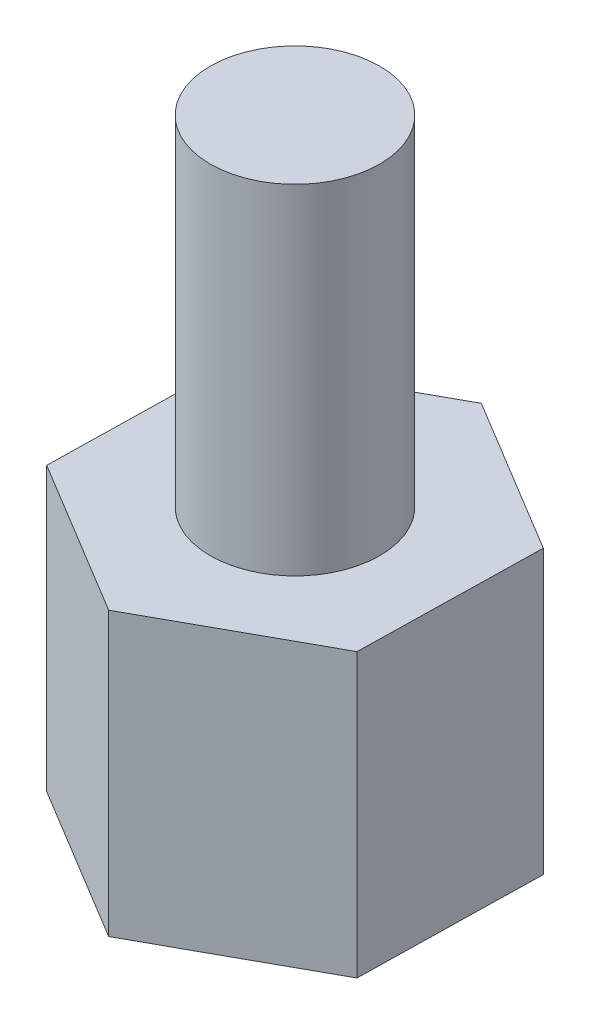
ISO-10303-21;
HEADER;
FILE_DESCRIPTION(('STEP AP214'),'2;1');
FILE_NAME('part.step','',(''),(''),'','','');
FILE_SCHEMA(('AUTOMOTIVE_DESIGN { 1 0 10303 214 1 1 1 1 }'));
ENDSEC;
DATA;
#1=APPLICATION_CONTEXT('core data for automotive mechanical design processes');
#2=APPLICATION_PROTOCOL_DEFINITION('international standard','automotive_design',2000,#1);
#3=PRODUCT_CONTEXT('',#1,'mechanical');
#4=PRODUCT('Part','Part','',(#3));
#5=PRODUCT_RELATED_PRODUCT_CATEGORY('part','',(#4));
#6=PRODUCT_DEFINITION_FORMATION('','',#4);
#7=PRODUCT_DEFINITION_CONTEXT('part definition',#1,'design');
#8=PRODUCT_DEFINITION('design','',#6,#7);
#9=PRODUCT_DEFINITION_SHAPE('','',#8);
#10=(LENGTH_UNIT() NAMED_UNIT(*) SI_UNIT(.MILLI.,.METRE.));
#11=(NAMED_UNIT(*) PLANE_ANGLE_UNIT() SI_UNIT($,.RADIAN.));
#12=(NAMED_UNIT(*) SI_UNIT($,.STERADIAN.) SOLID_ANGLE_UNIT());
#13=UNCERTAINTY_MEASURE_WITH_UNIT(LENGTH_MEASURE(1.E-05),#10,'distance_accuracy_value','');
#14=(GEOMETRIC_REPRESENTATION_CONTEXT(3) GLOBAL_UNCERTAINTY_ASSIGNED_CONTEXT((#13)) GLOBAL_UNIT_ASSIGNED_CONTEXT((#10,
#11,#12)) REPRESENTATION_CONTEXT('',''));
#15=CARTESIAN_POINT('',(0.,0.,0.));
#16=DIRECTION('',(0.,0.,1.));
#17=DIRECTION('',(1.,0.,0.));
#18=AXIS2_PLACEMENT_3D('',#15,#16,#17);
#19=CARTESIAN_POINT('',(0.,11.,0.));
#20=DIRECTION('',(0.,-1.,0.));
#21=DIRECTION('',(0.,0.,-1.));
#22=AXIS2_PLACEMENT_3D('',#19,#20,#21);
#23=CYLINDRICAL_SURFACE('',#22,1.5);
#24=CARTESIAN_POINT('',(0.,11.,0.));
#25=DIRECTION('',(0.,1.,0.));
#26=DIRECTION('',(0.,0.,1.));
#27=AXIS2_PLACEMENT_3D('',#24,#25,#26);
#28=CIRCLE('',#27,1.5);
#29=CARTESIAN_POINT('',(0.,11.,1.5));
#30=VERTEX_POINT('',#29);
#31=EDGE_CURVE('E11',#30,#30,#28,.T.);
#32=ORIENTED_EDGE('',*,*,#31,.F.);
#33=EDGE_LOOP('',(#32));
#34=FACE_BOUND('',#33,.T.);
#35=CARTESIAN_POINT('',(0.,5.,0.));
#36=DIRECTION('',(0.,1.,0.));
#37=DIRECTION('',(0.,0.,1.));
#38=AXIS2_PLACEMENT_3D('',#35,#36,#37);
#39=CIRCLE('',#38,1.5);
#40=CARTESIAN_POINT('',(0.,5.,1.5));
#41=VERTEX_POINT('',#40);
#42=EDGE_CURVE('E50',#41,#41,#39,.T.);
#43=ORIENTED_EDGE('',*,*,#42,.T.);
#44=EDGE_LOOP('',(#43));
#45=FACE_BOUND('',#44,.T.);
#46=ADVANCED_FACE('F47',(#34,#45),#23,.T.);
#47=CARTESIAN_POINT('',(0.,11.,0.));
#48=DIRECTION('',(0.,1.,0.));
#49=DIRECTION('',(0.,0.,1.));
#50=AXIS2_PLACEMENT_3D('',#47,#48,#49);
#51=PLANE('',#50);
#52=ORIENTED_EDGE('',*,*,#31,.T.);
#53=EDGE_LOOP('',(#52));
#54=FACE_BOUND('',#53,.T.);
#55=ADVANCED_FACE('F62',(#54),#51,.T.);
#56=CARTESIAN_POINT('',(0.,5.,0.));
#57=DIRECTION('',(0.,1.,0.));
#58=DIRECTION('',(0.,0.,1.));
#59=AXIS2_PLACEMENT_3D('',#56,#57,#58);
#60=PLANE('',#59);
#61=ORIENTED_EDGE('',*,*,#42,.F.);
#62=EDGE_LOOP('',(#61));
#63=FACE_BOUND('',#62,.T.);
#64=ADVANCED_FACE('F60',(#63),#60,.F.);
#65=CLOSED_SHELL('',(#46,#55,#64));
#66=MANIFOLD_SOLID_BREP('B2',#65);
#67=CARTESIAN_POINT('',(0.,5.,0.));
#68=DIRECTION('',(0.,1.,0.));
#69=DIRECTION('',(0.,0.,1.));
#70=AXIS2_PLACEMENT_3D('',#67,#68,#69);
#71=PLANE('',#70);
#72=DIRECTION('',(0.875653992832007,0.,-0.482939007367767));
#73=VECTOR('',#72,1.);
#74=CARTESIAN_POINT('',(-0.0633361711101356,5.,3.23254108446628));
#75=LINE('',#74,#73);
#76=CARTESIAN_POINT('',(-0.0633361711101356,5.,3.23254108446628));
#77=VERTEX_POINT('',#76);
#78=CARTESIAN_POINT('',(2.76779461236963,5.,1.67112127539296));
#79=VERTEX_POINT('',#78);
#80=EDGE_CURVE('E195',#77,#79,#75,.T.);
#81=ORIENTED_EDGE('',*,*,#80,.T.);
#82=DIRECTION('',(0.0195895475570768,0.,-0.999808106401678));
#83=VECTOR('',#82,1.);
#84=CARTESIAN_POINT('',(2.76779461236963,5.,1.67112127539296));
#85=LINE('',#84,#83);
#86=CARTESIAN_POINT('',(2.83113078347977,5.,-1.56141980907333));
#87=VERTEX_POINT('',#86);
#88=EDGE_CURVE('E143',#79,#87,#85,.T.);
#89=ORIENTED_EDGE('',*,*,#88,.T.);
#90=DIRECTION('',(-0.85606444527493,0.,-0.516869099033911));
#91=VECTOR('',#90,1.);
#92=CARTESIAN_POINT('',(2.83113078347977,5.,-1.56141980907333));
#93=LINE('',#92,#91);
#94=CARTESIAN_POINT('',(0.063336171110136,5.,-3.23254108446628));
#95=VERTEX_POINT('',#94);
#96=EDGE_CURVE('E156',#87,#95,#93,.T.);
#97=ORIENTED_EDGE('',*,*,#96,.T.);
#98=DIRECTION('',(-0.875653992832007,0.,0.482939007367767));
#99=VECTOR('',#98,1.);
#100=CARTESIAN_POINT('',(0.063336171110136,5.,-3.23254108446628));
#101=LINE('',#100,#99);
#102=CARTESIAN_POINT('',(-2.76779461236963,5.,-1.67112127539296));
#103=VERTEX_POINT('',#102);
#104=EDGE_CURVE('E150',#95,#103,#101,.T.);
#105=ORIENTED_EDGE('',*,*,#104,.T.);
#106=DIRECTION('',(-0.0195895475570772,0.,0.999808106401678));
#107=VECTOR('',#106,1.);
#108=CARTESIAN_POINT('',(-2.76779461236963,5.,-1.67112127539296));
#109=LINE('',#108,#107);
#110=CARTESIAN_POINT('',(-2.83113078347977,5.,1.56141980907332));
#111=VERTEX_POINT('',#110);
#112=EDGE_CURVE('E154',#103,#111,#109,.T.);
#113=ORIENTED_EDGE('',*,*,#112,.T.);
#114=DIRECTION('',(0.85606444527493,0.,0.516869099033911));
#115=VECTOR('',#114,1.);
#116=CARTESIAN_POINT('',(-2.83113078347977,5.,1.56141980907332));
#117=LINE('',#116,#115);
#118=EDGE_CURVE('E106',#111,#77,#117,.T.);
#119=ORIENTED_EDGE('',*,*,#118,.T.);
#120=EDGE_LOOP('',(#81,#89,#97,#105,#113,#119));
#121=FACE_BOUND('',#120,.T.);
#122=CARTESIAN_POINT('',(0.,5.,0.));
#123=DIRECTION('',(0.,1.,0.));
#124=DIRECTION('',(0.,0.,1.));
#125=AXIS2_PLACEMENT_3D('',#122,#123,#124);
#126=CIRCLE('',#125,1.5);
#127=CARTESIAN_POINT('',(0.,5.,1.5));
#128=VERTEX_POINT('',#127);
#129=EDGE_CURVE('E183',#128,#128,#126,.T.);
#130=ORIENTED_EDGE('',*,*,#129,.F.);
#131=EDGE_LOOP('',(#130));
#132=FACE_BOUND('',#131,.T.);
#133=ADVANCED_FACE('F88',(#121,#132),#71,.T.);
#134=CARTESIAN_POINT('',(0.,0.,0.));
#135=DIRECTION('',(0.,1.,0.));
#136=DIRECTION('',(0.,0.,1.));
#137=AXIS2_PLACEMENT_3D('',#134,#135,#136);
#138=PLANE('',#137);
#139=DIRECTION('',(0.875653992832007,0.,-0.482939007367767));
#140=VECTOR('',#139,1.);
#141=CARTESIAN_POINT('',(-0.0633361711101356,0.,3.23254108446628));
#142=LINE('',#141,#140);
#143=CARTESIAN_POINT('',(-0.0633361711101356,0.,3.23254108446628));
#144=VERTEX_POINT('',#143);
#145=CARTESIAN_POINT('',(2.76779461236963,0.,1.67112127539296));
#146=VERTEX_POINT('',#145);
#147=EDGE_CURVE('E178',#144,#146,#142,.T.);
#148=ORIENTED_EDGE('',*,*,#147,.F.);
#149=DIRECTION('',(0.85606444527493,0.,0.516869099033911));
#150=VECTOR('',#149,1.);
#151=CARTESIAN_POINT('',(-2.83113078347977,0.,1.56141980907332));
#152=LINE('',#151,#150);
#153=CARTESIAN_POINT('',(-2.83113078347977,0.,1.56141980907332));
#154=VERTEX_POINT('',#153);
#155=EDGE_CURVE('E135',#154,#144,#152,.T.);
#156=ORIENTED_EDGE('',*,*,#155,.F.);
#157=DIRECTION('',(-0.0195895475570772,0.,0.999808106401678));
#158=VECTOR('',#157,1.);
#159=CARTESIAN_POINT('',(-2.76779461236963,0.,-1.67112127539296));
#160=LINE('',#159,#158);
#161=CARTESIAN_POINT('',(-2.76779461236963,0.,-1.67112127539296));
#162=VERTEX_POINT('',#161);
#163=EDGE_CURVE('E129',#162,#154,#160,.T.);
#164=ORIENTED_EDGE('',*,*,#163,.F.);
#165=DIRECTION('',(-0.875653992832007,0.,0.482939007367767));
#166=VECTOR('',#165,1.);
#167=CARTESIAN_POINT('',(0.063336171110136,0.,-3.23254108446628));
#168=LINE('',#167,#166);
#169=CARTESIAN_POINT('',(0.063336171110136,0.,-3.23254108446628));
#170=VERTEX_POINT('',#169);
#171=EDGE_CURVE('E165',#170,#162,#168,.T.);
#172=ORIENTED_EDGE('',*,*,#171,.F.);
#173=DIRECTION('',(-0.85606444527493,0.,-0.516869099033911));
#174=VECTOR('',#173,1.);
#175=CARTESIAN_POINT('',(2.83113078347977,0.,-1.56141980907333));
#176=LINE('',#175,#174);
#177=CARTESIAN_POINT('',(2.83113078347977,0.,-1.56141980907333));
#178=VERTEX_POINT('',#177);
#179=EDGE_CURVE('E186',#178,#170,#176,.T.);
#180=ORIENTED_EDGE('',*,*,#179,.F.);
#181=DIRECTION('',(0.0195895475570768,0.,-0.999808106401678));
#182=VECTOR('',#181,1.);
#183=CARTESIAN_POINT('',(2.76779461236963,0.,1.67112127539296));
#184=LINE('',#183,#182);
#185=EDGE_CURVE('E182',#146,#178,#184,.T.);
#186=ORIENTED_EDGE('',*,*,#185,.F.);
#187=EDGE_LOOP('',(#148,#156,#164,#172,#180,#186));
#188=FACE_BOUND('',#187,.T.);
#189=CARTESIAN_POINT('',(0.,0.,0.));
#190=DIRECTION('',(0.,1.,0.));
#191=DIRECTION('',(0.,0.,1.));
#192=AXIS2_PLACEMENT_3D('',#189,#190,#191);
#193=CIRCLE('',#192,1.5);
#194=CARTESIAN_POINT('',(0.,0.,1.5));
#195=VERTEX_POINT('',#194);
#196=EDGE_CURVE('E292',#195,#195,#193,.T.);
#197=ORIENTED_EDGE('',*,*,#196,.T.);
#198=EDGE_LOOP('',(#197));
#199=FACE_BOUND('',#198,.T.);
#200=ADVANCED_FACE('F208',(#188,#199),#138,.F.);
#201=CARTESIAN_POINT('',(-0.0633361711101356,5.,3.23254108446628));
#202=DIRECTION('',(-0.482939007367767,0.,-0.875653992832007));
#203=DIRECTION('',(-0.875653992832007,0.,0.482939007367767));
#204=AXIS2_PLACEMENT_3D('',#201,#202,#203);
#205=PLANE('',#204);
#206=ORIENTED_EDGE('',*,*,#147,.T.);
#207=DIRECTION('',(0.,-1.,0.));
#208=VECTOR('',#207,1.);
#209=CARTESIAN_POINT('',(2.76779461236963,5.,1.67112127539296));
#210=LINE('',#209,#208);
#211=EDGE_CURVE('E45',#79,#146,#210,.T.);
#212=ORIENTED_EDGE('',*,*,#211,.F.);
#213=ORIENTED_EDGE('',*,*,#80,.F.);
#214=DIRECTION('',(0.,-1.,0.));
#215=VECTOR('',#214,1.);
#216=CARTESIAN_POINT('',(-0.0633361711101356,5.,3.23254108446628));
#217=LINE('',#216,#215);
#218=EDGE_CURVE('E174',#77,#144,#217,.T.);
#219=ORIENTED_EDGE('',*,*,#218,.T.);
#220=EDGE_LOOP('',(#206,#212,#213,#219));
#221=FACE_BOUND('',#220,.T.);
#222=ADVANCED_FACE('F90',(#221),#205,.F.);
#223=CARTESIAN_POINT('',(2.76779461236963,5.,1.67112127539296));
#224=DIRECTION('',(-0.999808106401678,0.,-0.0195895475570768));
#225=DIRECTION('',(-0.0195895475570768,0.,0.999808106401678));
#226=AXIS2_PLACEMENT_3D('',#223,#224,#225);
#227=PLANE('',#226);
#228=ORIENTED_EDGE('',*,*,#185,.T.);
#229=DIRECTION('',(0.,-1.,0.));
#230=VECTOR('',#229,1.);
#231=CARTESIAN_POINT('',(2.83113078347977,5.,-1.56141980907333));
#232=LINE('',#231,#230);
#233=EDGE_CURVE('E98',#87,#178,#232,.T.);
#234=ORIENTED_EDGE('',*,*,#233,.F.);
#235=ORIENTED_EDGE('',*,*,#88,.F.);
#236=ORIENTED_EDGE('',*,*,#211,.T.);
#237=EDGE_LOOP('',(#228,#234,#235,#236));
#238=FACE_BOUND('',#237,.T.);
#239=ADVANCED_FACE('F233',(#238),#227,.F.);
#240=CARTESIAN_POINT('',(2.83113078347977,5.,-1.56141980907333));
#241=DIRECTION('',(-0.516869099033911,0.,0.85606444527493));
#242=DIRECTION('',(0.85606444527493,0.,0.516869099033911));
#243=AXIS2_PLACEMENT_3D('',#240,#241,#242);
#244=PLANE('',#243);
#245=ORIENTED_EDGE('',*,*,#179,.T.);
#246=DIRECTION('',(0.,-1.,0.));
#247=VECTOR('',#246,1.);
#248=CARTESIAN_POINT('',(0.063336171110136,5.,-3.23254108446628));
#249=LINE('',#248,#247);
#250=EDGE_CURVE('E167',#95,#170,#249,.T.);
#251=ORIENTED_EDGE('',*,*,#250,.F.);
#252=ORIENTED_EDGE('',*,*,#96,.F.);
#253=ORIENTED_EDGE('',*,*,#233,.T.);
#254=EDGE_LOOP('',(#245,#251,#252,#253));
#255=FACE_BOUND('',#254,.T.);
#256=ADVANCED_FACE('F205',(#255),#244,.F.);
#257=CARTESIAN_POINT('',(0.063336171110136,5.,-3.23254108446628));
#258=DIRECTION('',(0.482939007367767,0.,0.875653992832007));
#259=DIRECTION('',(0.875653992832007,0.,-0.482939007367767));
#260=AXIS2_PLACEMENT_3D('',#257,#258,#259);
#261=PLANE('',#260);
#262=ORIENTED_EDGE('',*,*,#171,.T.);
#263=DIRECTION('',(0.,-1.,0.));
#264=VECTOR('',#263,1.);
#265=CARTESIAN_POINT('',(-2.76779461236963,5.,-1.67112127539296));
#266=LINE('',#265,#264);
#267=EDGE_CURVE('E162',#103,#162,#266,.T.);
#268=ORIENTED_EDGE('',*,*,#267,.F.);
#269=ORIENTED_EDGE('',*,*,#104,.F.);
#270=ORIENTED_EDGE('',*,*,#250,.T.);
#271=EDGE_LOOP('',(#262,#268,#269,#270));
#272=FACE_BOUND('',#271,.T.);
#273=ADVANCED_FACE('F163',(#272),#261,.F.);
#274=CARTESIAN_POINT('',(-2.76779461236963,5.,-1.67112127539296));
#275=DIRECTION('',(0.999808106401678,0.,0.0195895475570772));
#276=DIRECTION('',(0.0195895475570772,0.,-0.999808106401678));
#277=AXIS2_PLACEMENT_3D('',#274,#275,#276);
#278=PLANE('',#277);
#279=ORIENTED_EDGE('',*,*,#163,.T.);
#280=DIRECTION('',(0.,-1.,0.));
#281=VECTOR('',#280,1.);
#282=CARTESIAN_POINT('',(-2.83113078347977,5.,1.56141980907332));
#283=LINE('',#282,#281);
#284=EDGE_CURVE('E168',#111,#154,#283,.T.);
#285=ORIENTED_EDGE('',*,*,#284,.F.);
#286=ORIENTED_EDGE('',*,*,#112,.F.);
#287=ORIENTED_EDGE('',*,*,#267,.T.);
#288=EDGE_LOOP('',(#279,#285,#286,#287));
#289=FACE_BOUND('',#288,.T.);
#290=ADVANCED_FACE('F170',(#289),#278,.F.);
#291=CARTESIAN_POINT('',(-2.83113078347977,5.,1.56141980907332));
#292=DIRECTION('',(0.516869099033911,0.,-0.85606444527493));
#293=DIRECTION('',(-0.85606444527493,0.,-0.516869099033911));
#294=AXIS2_PLACEMENT_3D('',#291,#292,#293);
#295=PLANE('',#294);
#296=ORIENTED_EDGE('',*,*,#155,.T.);
#297=ORIENTED_EDGE('',*,*,#218,.F.);
#298=ORIENTED_EDGE('',*,*,#118,.F.);
#299=ORIENTED_EDGE('',*,*,#284,.T.);
#300=EDGE_LOOP('',(#296,#297,#298,#299));
#301=FACE_BOUND('',#300,.T.);
#302=ADVANCED_FACE('F213',(#301),#295,.F.);
#303=CARTESIAN_POINT('',(0.,5.,0.));
#304=DIRECTION('',(0.,-1.,0.));
#305=DIRECTION('',(0.,0.,-1.));
#306=AXIS2_PLACEMENT_3D('',#303,#304,#305);
#307=CYLINDRICAL_SURFACE('',#306,1.5);
#308=ORIENTED_EDGE('',*,*,#129,.T.);
#309=EDGE_LOOP('',(#308));
#310=FACE_BOUND('',#309,.T.);
#311=ORIENTED_EDGE('',*,*,#196,.F.);
#312=EDGE_LOOP('',(#311));
#313=FACE_BOUND('',#312,.T.);
#314=ADVANCED_FACE('F215',(#310,#313),#307,.F.);
#315=CLOSED_SHELL('',(#133,#200,#222,#239,#256,#273,#290,#302,#314));
#316=MANIFOLD_SOLID_BREP('B6',#315);
#317=ADVANCED_BREP_SHAPE_REPRESENTATION('',(#18,#66,#316),#14);
#318=SHAPE_DEFINITION_REPRESENTATION(#9,#317);
ENDSEC;
END-ISO-10303-21;
